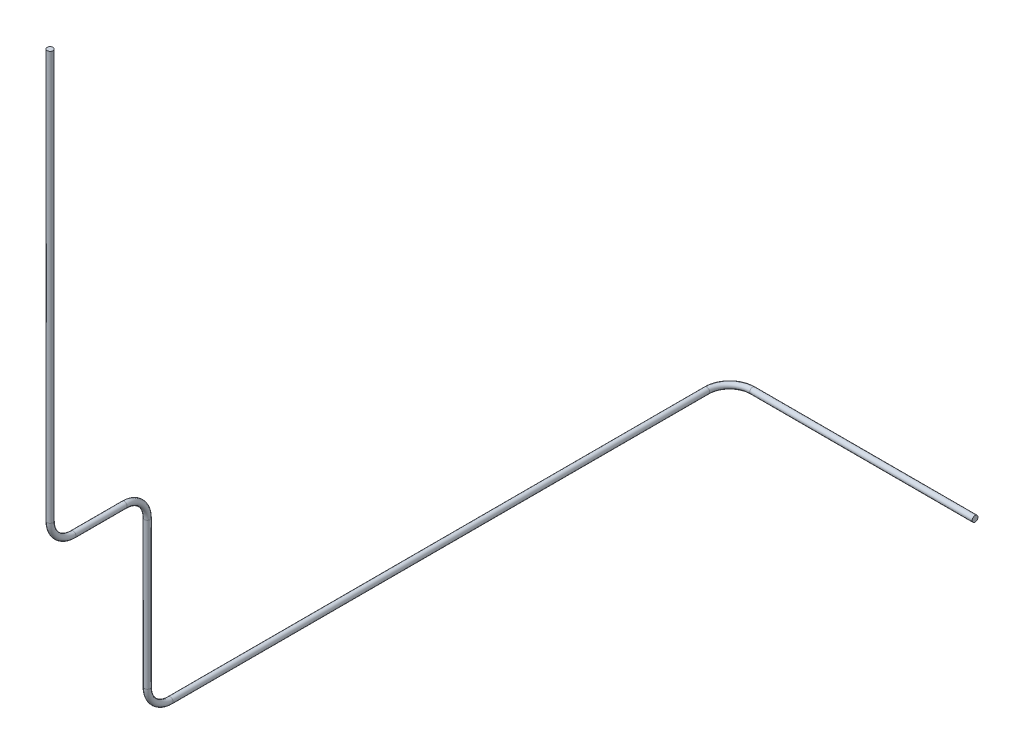
ISO-10303-21;
HEADER;
FILE_DESCRIPTION(('STEP AP214'),'2;1');
FILE_NAME('part.step','',(''),(''),'','','');
FILE_SCHEMA(('AUTOMOTIVE_DESIGN { 1 0 10303 214 1 1 1 1 }'));
ENDSEC;
DATA;
#1=APPLICATION_CONTEXT('core data for automotive mechanical design processes');
#2=APPLICATION_PROTOCOL_DEFINITION('international standard','automotive_design',2000,#1);
#3=PRODUCT_CONTEXT('',#1,'mechanical');
#4=PRODUCT('Part','Part','',(#3));
#5=PRODUCT_RELATED_PRODUCT_CATEGORY('part','',(#4));
#6=PRODUCT_DEFINITION_FORMATION('','',#4);
#7=PRODUCT_DEFINITION_CONTEXT('part definition',#1,'design');
#8=PRODUCT_DEFINITION('design','',#6,#7);
#9=PRODUCT_DEFINITION_SHAPE('','',#8);
#10=(LENGTH_UNIT() NAMED_UNIT(*) SI_UNIT(.MILLI.,.METRE.));
#11=(NAMED_UNIT(*) PLANE_ANGLE_UNIT() SI_UNIT($,.RADIAN.));
#12=(NAMED_UNIT(*) SI_UNIT($,.STERADIAN.) SOLID_ANGLE_UNIT());
#13=UNCERTAINTY_MEASURE_WITH_UNIT(LENGTH_MEASURE(1.E-05),#10,'distance_accuracy_value','');
#14=(GEOMETRIC_REPRESENTATION_CONTEXT(3) GLOBAL_UNCERTAINTY_ASSIGNED_CONTEXT((#13)) GLOBAL_UNIT_ASSIGNED_CONTEXT((#10,
#11,#12)) REPRESENTATION_CONTEXT('',''));
#15=CARTESIAN_POINT('',(0.,0.,0.));
#16=DIRECTION('',(0.,0.,1.));
#17=DIRECTION('',(1.,0.,0.));
#18=AXIS2_PLACEMENT_3D('',#15,#16,#17);
#19=CARTESIAN_POINT('',(-937.241981619214,-1278.81069577198,2027.31999999998));
#20=DIRECTION('',(1.,0.,0.));
#21=DIRECTION('',(0.,1.,0.));
#22=AXIS2_PLACEMENT_3D('',#19,#20,#21);
#23=PLANE('',#22);
#24=CARTESIAN_POINT('',(-937.241981619214,-1278.81069577198,2027.31999999998));
#25=DIRECTION('',(1.,0.,0.));
#26=DIRECTION('',(0.,1.,0.));
#27=AXIS2_PLACEMENT_3D('',#24,#25,#26);
#28=CIRCLE('',#27,6.35000000000008);
#29=CARTESIAN_POINT('',(-937.241981619214,-1272.46069577198,2027.31999999998));
#30=VERTEX_POINT('',#29);
#31=EDGE_CURVE('E57',#30,#30,#28,.T.);
#32=ORIENTED_EDGE('',*,*,#31,.T.);
#33=EDGE_LOOP('',(#32));
#34=FACE_BOUND('',#33,.T.);
#35=ADVANCED_FACE('F45',(#34),#23,.T.);
#36=CARTESIAN_POINT('',(-1471.55298338921,79.733825002156,3506.88303329804));
#37=DIRECTION('',(0.,-1.,0.));
#38=DIRECTION('',(0.,0.,-1.));
#39=AXIS2_PLACEMENT_3D('',#36,#37,#38);
#40=PLANE('',#39);
#41=CARTESIAN_POINT('',(-1471.55298338921,79.733825002156,3506.88303329804));
#42=DIRECTION('',(0.,-1.,0.));
#43=DIRECTION('',(0.,0.,-1.));
#44=AXIS2_PLACEMENT_3D('',#41,#42,#43);
#45=CIRCLE('',#44,6.35000000000008);
#46=CARTESIAN_POINT('',(-1471.55298338921,79.733825002156,3500.53303329804));
#47=VERTEX_POINT('',#46);
#48=EDGE_CURVE('E12',#47,#47,#45,.T.);
#49=ORIENTED_EDGE('',*,*,#48,.F.);
#50=EDGE_LOOP('',(#49));
#51=FACE_BOUND('',#50,.T.);
#52=ADVANCED_FACE('F63',(#51),#40,.F.);
#53=CARTESIAN_POINT('',(-937.241981619214,-1278.81069577198,2027.31999999998));
#54=DIRECTION('',(-1.,0.,0.));
#55=DIRECTION('',(0.,0.,1.));
#56=AXIS2_PLACEMENT_3D('',#53,#54,#55);
#57=CYLINDRICAL_SURFACE('',#56,6.35000000000008);
#58=CARTESIAN_POINT('',(-1421.55298338921,-1278.81069577198,2027.31999999998));
#59=DIRECTION('',(1.,0.,0.));
#60=DIRECTION('',(0.,1.,0.));
#61=AXIS2_PLACEMENT_3D('',#58,#59,#60);
#62=CIRCLE('',#61,6.35000000000008);
#63=CARTESIAN_POINT('',(-1421.55298338921,-1278.81069577198,2020.96999999998));
#64=VERTEX_POINT('',#63);
#65=EDGE_CURVE('E113',#64,#64,#62,.T.);
#66=ORIENTED_EDGE('',*,*,#65,.T.);
#67=EDGE_LOOP('',(#66));
#68=FACE_BOUND('',#67,.T.);
#69=ORIENTED_EDGE('',*,*,#31,.F.);
#70=EDGE_LOOP('',(#69));
#71=FACE_BOUND('',#70,.T.);
#72=ADVANCED_FACE('F65',(#68,#71),#57,.T.);
#73=CARTESIAN_POINT('',(-1421.55298338921,-1278.81069577198,2077.31999999998));
#74=DIRECTION('',(0.,1.,0.));
#75=DIRECTION('',(0.,0.,1.));
#76=AXIS2_PLACEMENT_3D('',#73,#74,#75);
#77=TOROIDAL_SURFACE('',#76,49.9999999999998,6.35000000000008);
#78=CARTESIAN_POINT('',(-1471.55298338921,-1278.81069577198,2077.31999999998));
#79=DIRECTION('',(0.,0.,-1.));
#80=DIRECTION('',(0.,1.,0.));
#81=AXIS2_PLACEMENT_3D('',#78,#79,#80);
#82=CIRCLE('',#81,6.35000000000008);
#83=CARTESIAN_POINT('',(-1477.90298338921,-1278.81069577198,2077.31999999998));
#84=VERTEX_POINT('',#83);
#85=EDGE_CURVE('E110',#84,#84,#82,.T.);
#86=CARTESIAN_POINT('',(-1421.55298338921,-1278.81069577198,2077.31999999998));
#87=DIRECTION('',(0.,1.,0.));
#88=DIRECTION('',(0.,0.,1.));
#89=AXIS2_PLACEMENT_3D('',#86,#87,#88);
#90=CIRCLE('',#89,56.3499999999999);
#91=EDGE_CURVE('',#64,#84,#90,.T.);
#92=ORIENTED_EDGE('',*,*,#65,.F.);
#93=ORIENTED_EDGE('',*,*,#85,.T.);
#94=ORIENTED_EDGE('',*,*,#91,.T.);
#95=ORIENTED_EDGE('',*,*,#91,.F.);
#96=EDGE_LOOP('',(#92,#94,#93,#95));
#97=FACE_BOUND('',#96,.T.);
#98=ADVANCED_FACE('F70',(#97),#77,.T.);
#99=CARTESIAN_POINT('',(-1471.55298338921,-1278.81069577198,2077.31999999998));
#100=DIRECTION('',(0.,0.,1.));
#101=DIRECTION('',(1.,0.,0.));
#102=AXIS2_PLACEMENT_3D('',#99,#100,#101);
#103=CYLINDRICAL_SURFACE('',#102,6.35000000000008);
#104=CARTESIAN_POINT('',(-1471.55298338921,-1278.81069577198,3245.48735780804));
#105=DIRECTION('',(0.,0.,-1.));
#106=DIRECTION('',(0.,1.,0.));
#107=AXIS2_PLACEMENT_3D('',#104,#105,#106);
#108=CIRCLE('',#107,6.35000000000008);
#109=CARTESIAN_POINT('',(-1471.55298338921,-1285.16069577198,3245.48735780804));
#110=VERTEX_POINT('',#109);
#111=EDGE_CURVE('E115',#110,#110,#108,.T.);
#112=ORIENTED_EDGE('',*,*,#111,.T.);
#113=EDGE_LOOP('',(#112));
#114=FACE_BOUND('',#113,.T.);
#115=ORIENTED_EDGE('',*,*,#85,.F.);
#116=EDGE_LOOP('',(#115));
#117=FACE_BOUND('',#116,.T.);
#118=ADVANCED_FACE('F98',(#114,#117),#103,.T.);
#119=CARTESIAN_POINT('',(-1471.55298338922,-1228.81069577198,3245.48735780804));
#120=DIRECTION('',(-1.,0.,0.));
#121=DIRECTION('',(0.,0.,1.));
#122=AXIS2_PLACEMENT_3D('',#119,#120,#121);
#123=TOROIDAL_SURFACE('',#122,49.9999999999998,6.35000000000008);
#124=CARTESIAN_POINT('',(-1471.55298338922,-1228.81069577198,3295.48735780804));
#125=DIRECTION('',(0.,-1.,0.));
#126=DIRECTION('',(0.,0.,-1.));
#127=AXIS2_PLACEMENT_3D('',#124,#125,#126);
#128=CIRCLE('',#127,6.35000000000008);
#129=CARTESIAN_POINT('',(-1471.55298338922,-1228.81069577198,3301.83735780804));
#130=VERTEX_POINT('',#129);
#131=EDGE_CURVE('E121',#130,#130,#128,.T.);
#132=CARTESIAN_POINT('',(-1471.55298338922,-1228.81069577198,3245.48735780804));
#133=DIRECTION('',(-1.,0.,0.));
#134=DIRECTION('',(0.,0.,1.));
#135=AXIS2_PLACEMENT_3D('',#132,#133,#134);
#136=CIRCLE('',#135,56.3499999999999);
#137=EDGE_CURVE('',#110,#130,#136,.T.);
#138=ORIENTED_EDGE('',*,*,#111,.F.);
#139=ORIENTED_EDGE('',*,*,#131,.T.);
#140=ORIENTED_EDGE('',*,*,#137,.T.);
#141=ORIENTED_EDGE('',*,*,#137,.F.);
#142=EDGE_LOOP('',(#138,#140,#139,#141));
#143=FACE_BOUND('',#142,.T.);
#144=ADVANCED_FACE('F94',(#143),#123,.T.);
#145=CARTESIAN_POINT('',(-1471.55298338921,-1228.81069577196,3295.48735780804));
#146=DIRECTION('',(0.,1.,0.));
#147=DIRECTION('',(-1.,0.,0.));
#148=AXIS2_PLACEMENT_3D('',#145,#146,#147);
#149=CYLINDRICAL_SURFACE('',#148,6.35000000000008);
#150=CARTESIAN_POINT('',(-1471.55298338922,-910.190731412472,3295.48735780804));
#151=DIRECTION('',(0.,-1.,0.));
#152=DIRECTION('',(0.,0.,-1.));
#153=AXIS2_PLACEMENT_3D('',#150,#151,#152);
#154=CIRCLE('',#153,6.35000000000008);
#155=CARTESIAN_POINT('',(-1471.55298338922,-910.19073141247,3289.13735780804));
#156=VERTEX_POINT('',#155);
#157=EDGE_CURVE('E124',#156,#156,#154,.T.);
#158=ORIENTED_EDGE('',*,*,#157,.T.);
#159=EDGE_LOOP('',(#158));
#160=FACE_BOUND('',#159,.T.);
#161=ORIENTED_EDGE('',*,*,#131,.F.);
#162=EDGE_LOOP('',(#161));
#163=FACE_BOUND('',#162,.T.);
#164=ADVANCED_FACE('F90',(#160,#163),#149,.T.);
#165=CARTESIAN_POINT('',(-1471.55298338922,-910.190731412488,3345.48735780804));
#166=DIRECTION('',(1.,0.,0.));
#167=DIRECTION('',(0.,0.,-1.));
#168=AXIS2_PLACEMENT_3D('',#165,#166,#167);
#169=TOROIDAL_SURFACE('',#168,49.9999999999998,6.35000000000008);
#170=CARTESIAN_POINT('',(-1471.55298338922,-860.190731412489,3345.48735780804));
#171=DIRECTION('',(0.,0.,-1.));
#172=DIRECTION('',(0.,1.,0.));
#173=AXIS2_PLACEMENT_3D('',#170,#171,#172);
#174=CIRCLE('',#173,6.35000000000008);
#175=CARTESIAN_POINT('',(-1471.55298338922,-853.840731412488,3345.48735780804));
#176=VERTEX_POINT('',#175);
#177=EDGE_CURVE('E127',#176,#176,#174,.T.);
#178=CARTESIAN_POINT('',(-1471.55298338922,-910.190731412488,3345.48735780804));
#179=DIRECTION('',(1.,0.,0.));
#180=DIRECTION('',(0.,0.,-1.));
#181=AXIS2_PLACEMENT_3D('',#178,#179,#180);
#182=CIRCLE('',#181,56.3499999999999);
#183=EDGE_CURVE('',#156,#176,#182,.T.);
#184=ORIENTED_EDGE('',*,*,#157,.F.);
#185=ORIENTED_EDGE('',*,*,#177,.T.);
#186=ORIENTED_EDGE('',*,*,#183,.T.);
#187=ORIENTED_EDGE('',*,*,#183,.F.);
#188=EDGE_LOOP('',(#184,#186,#185,#187));
#189=FACE_BOUND('',#188,.T.);
#190=ADVANCED_FACE('F86',(#189),#169,.T.);
#191=CARTESIAN_POINT('',(-1471.55298338922,-860.190731412489,3345.48735780804));
#192=DIRECTION('',(0.,0.,1.));
#193=DIRECTION('',(1.,0.,0.));
#194=AXIS2_PLACEMENT_3D('',#191,#192,#193);
#195=CYLINDRICAL_SURFACE('',#194,6.35000000000008);
#196=CARTESIAN_POINT('',(-1471.55298338921,-860.190731412489,3456.88303329804));
#197=DIRECTION('',(0.,0.,-1.));
#198=DIRECTION('',(0.,1.,0.));
#199=AXIS2_PLACEMENT_3D('',#196,#197,#198);
#200=CIRCLE('',#199,6.35000000000008);
#201=CARTESIAN_POINT('',(-1471.55298338921,-866.540731412488,3456.88303329804));
#202=VERTEX_POINT('',#201);
#203=EDGE_CURVE('E130',#202,#202,#200,.T.);
#204=ORIENTED_EDGE('',*,*,#203,.T.);
#205=EDGE_LOOP('',(#204));
#206=FACE_BOUND('',#205,.T.);
#207=ORIENTED_EDGE('',*,*,#177,.F.);
#208=EDGE_LOOP('',(#207));
#209=FACE_BOUND('',#208,.T.);
#210=ADVANCED_FACE('F80',(#206,#209),#195,.T.);
#211=CARTESIAN_POINT('',(-1471.55298338921,-810.190731412488,3456.88303329804));
#212=DIRECTION('',(-1.,0.,0.));
#213=DIRECTION('',(0.,0.,1.));
#214=AXIS2_PLACEMENT_3D('',#211,#212,#213);
#215=TOROIDAL_SURFACE('',#214,49.9999999999998,6.35000000000008);
#216=CARTESIAN_POINT('',(-1471.55298338921,-810.190731412488,3506.88303329804));
#217=DIRECTION('',(0.,-1.,0.));
#218=DIRECTION('',(0.,0.,-1.));
#219=AXIS2_PLACEMENT_3D('',#216,#217,#218);
#220=CIRCLE('',#219,6.35000000000008);
#221=CARTESIAN_POINT('',(-1471.55298338921,-810.190731412488,3513.23303329804));
#222=VERTEX_POINT('',#221);
#223=EDGE_CURVE('E52',#222,#222,#220,.T.);
#224=CARTESIAN_POINT('',(-1471.55298338921,-810.190731412488,3456.88303329804));
#225=DIRECTION('',(-1.,0.,0.));
#226=DIRECTION('',(0.,0.,1.));
#227=AXIS2_PLACEMENT_3D('',#224,#225,#226);
#228=CIRCLE('',#227,56.3499999999999);
#229=EDGE_CURVE('',#202,#222,#228,.T.);
#230=ORIENTED_EDGE('',*,*,#203,.F.);
#231=ORIENTED_EDGE('',*,*,#223,.T.);
#232=ORIENTED_EDGE('',*,*,#229,.T.);
#233=ORIENTED_EDGE('',*,*,#229,.F.);
#234=EDGE_LOOP('',(#230,#232,#231,#233));
#235=FACE_BOUND('',#234,.T.);
#236=ADVANCED_FACE('F76',(#235),#215,.T.);
#237=CARTESIAN_POINT('',(-1471.55298338921,-810.190731412488,3506.88303329804));
#238=DIRECTION('',(0.,1.,0.));
#239=DIRECTION('',(0.,0.,1.));
#240=AXIS2_PLACEMENT_3D('',#237,#238,#239);
#241=CYLINDRICAL_SURFACE('',#240,6.35000000000008);
#242=ORIENTED_EDGE('',*,*,#48,.T.);
#243=EDGE_LOOP('',(#242));
#244=FACE_BOUND('',#243,.T.);
#245=ORIENTED_EDGE('',*,*,#223,.F.);
#246=EDGE_LOOP('',(#245));
#247=FACE_BOUND('',#246,.T.);
#248=ADVANCED_FACE('F60',(#244,#247),#241,.T.);
#249=CLOSED_SHELL('',(#35,#52,#72,#98,#118,#144,#164,#190,#210,#236,#248));
#250=MANIFOLD_SOLID_BREP('B2',#249);
#251=ADVANCED_BREP_SHAPE_REPRESENTATION('',(#18,#250),#14);
#252=SHAPE_DEFINITION_REPRESENTATION(#9,#251);
ENDSEC;
END-ISO-10303-21;
